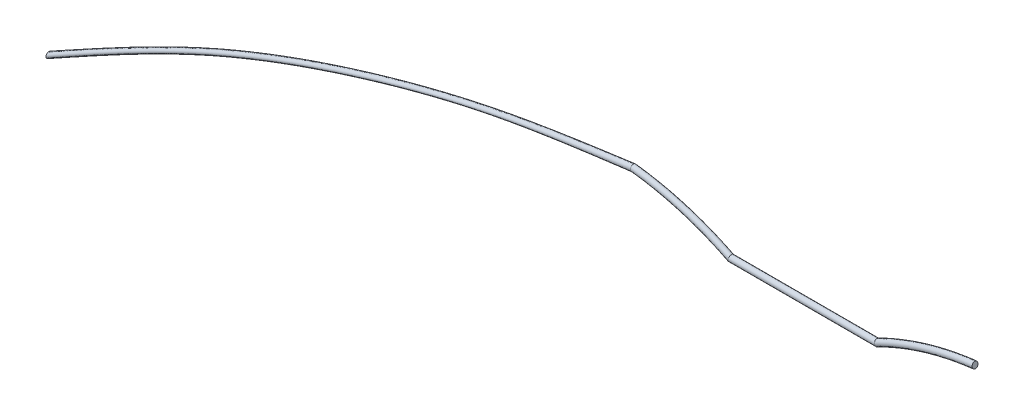
ISO-10303-21;
HEADER;
FILE_DESCRIPTION(('STEP AP214'),'2;1');
FILE_NAME('part.step','',(''),(''),'','','');
FILE_SCHEMA(('AUTOMOTIVE_DESIGN { 1 0 10303 214 1 1 1 1 }'));
ENDSEC;
DATA;
#1=APPLICATION_CONTEXT('core data for automotive mechanical design processes');
#2=APPLICATION_PROTOCOL_DEFINITION('international standard','automotive_design',2000,#1);
#3=PRODUCT_CONTEXT('',#1,'mechanical');
#4=PRODUCT('Part','Part','',(#3));
#5=PRODUCT_RELATED_PRODUCT_CATEGORY('part','',(#4));
#6=PRODUCT_DEFINITION_FORMATION('','',#4);
#7=PRODUCT_DEFINITION_CONTEXT('part definition',#1,'design');
#8=PRODUCT_DEFINITION('design','',#6,#7);
#9=PRODUCT_DEFINITION_SHAPE('','',#8);
#10=(LENGTH_UNIT() NAMED_UNIT(*) SI_UNIT(.MILLI.,.METRE.));
#11=(NAMED_UNIT(*) PLANE_ANGLE_UNIT() SI_UNIT($,.RADIAN.));
#12=(NAMED_UNIT(*) SI_UNIT($,.STERADIAN.) SOLID_ANGLE_UNIT());
#13=UNCERTAINTY_MEASURE_WITH_UNIT(LENGTH_MEASURE(1.E-05),#10,'distance_accuracy_value','');
#14=(GEOMETRIC_REPRESENTATION_CONTEXT(3) GLOBAL_UNCERTAINTY_ASSIGNED_CONTEXT((#13)) GLOBAL_UNIT_ASSIGNED_CONTEXT((#10,
#11,#12)) REPRESENTATION_CONTEXT('',''));
#15=CARTESIAN_POINT('',(0.,0.,0.));
#16=DIRECTION('',(0.,0.,1.));
#17=DIRECTION('',(1.,0.,0.));
#18=AXIS2_PLACEMENT_3D('',#15,#16,#17);
#19=CARTESIAN_POINT('',(-69.6424518241078,-26.4851945854484,-3.));
#20=CARTESIAN_POINT('',(-17.6556621893018,2.2418231542078,-2.99999999999825));
#21=CARTESIAN_POINT('',(85.9176675025857,59.4746875090797,-2.99999999999476));
#22=CARTESIAN_POINT('',(241.261624682536,115.88653819625,-3.00000000001895));
#23=CARTESIAN_POINT('',(389.29418202589,154.250267247059,-2.99999999994497));
#24=CARTESIAN_POINT('',(482.357328969648,166.585191522386,-3.00000000012178));
#25=CARTESIAN_POINT('',(529.270290602638,172.803204218905,-3.00000000021092));
#26=CARTESIAN_POINT('',(-69.6424518241078,-20.4851945854484,-3.));
#27=CARTESIAN_POINT('',(-17.3953350358502,8.2243355728806,-3.00000000001446));
#28=CARTESIAN_POINT('',(86.6966446877394,65.4223594030916,-3.00000000004327));
#29=CARTESIAN_POINT('',(242.439024030488,121.834458702321,-2.99999999984346));
#30=CARTESIAN_POINT('',(391.944921666677,159.620112669164,-3.00000000045462));
#31=CARTESIAN_POINT('',(483.265921419844,172.76618716726,-2.99999999899398));
#32=CARTESIAN_POINT('',(529.300669850343,179.393099202874,-2.99999999825767));
#33=CARTESIAN_POINT('',(-69.6424518241078,-20.4851945854484,3.));
#34=CARTESIAN_POINT('',(-17.3953350358502,8.2243355728806,2.99999999998554));
#35=CARTESIAN_POINT('',(86.6966446877394,65.4223594030916,2.99999999995673));
#36=CARTESIAN_POINT('',(242.439024030488,121.834458702321,3.00000000015654));
#37=CARTESIAN_POINT('',(391.944921666677,159.620112669164,2.99999999954538));
#38=CARTESIAN_POINT('',(483.265921419844,172.76618716726,3.00000000100602));
#39=CARTESIAN_POINT('',(529.300669850343,179.393099202874,3.00000000174233));
#40=CARTESIAN_POINT('',(-69.6424518241078,-26.4851945854484,3.));
#41=CARTESIAN_POINT('',(-17.6556621893018,2.2418231542078,3.00000000000175));
#42=CARTESIAN_POINT('',(85.9176675025857,59.4746875090797,3.00000000000524));
#43=CARTESIAN_POINT('',(241.261624682536,115.88653819625,2.99999999998105));
#44=CARTESIAN_POINT('',(389.29418202589,154.250267247059,3.00000000005504));
#45=CARTESIAN_POINT('',(482.357328969648,166.585191522386,2.99999999987822));
#46=CARTESIAN_POINT('',(529.270290602638,172.803204218905,2.99999999978908));
#47=CARTESIAN_POINT('',(-69.6424518241078,-32.4851945854484,3.));
#48=CARTESIAN_POINT('',(-17.9159893427533,-3.74068926446501,3.00000000001796));
#49=CARTESIAN_POINT('',(85.1386903174321,53.5270156150678,3.00000000005374));
#50=CARTESIAN_POINT('',(240.084225334583,109.93861769018,2.99999999980556));
#51=CARTESIAN_POINT('',(386.643442385103,148.880421824954,3.00000000056469));
#52=CARTESIAN_POINT('',(481.448736519453,160.404195877512,2.99999999875041));
#53=CARTESIAN_POINT('',(529.239911354932,166.213309234936,2.99999999783584));
#54=CARTESIAN_POINT('',(-69.6424518241078,-32.4851945854484,-3.));
#55=CARTESIAN_POINT('',(-17.9159893427533,-3.74068926446501,-2.99999999998204));
#56=CARTESIAN_POINT('',(85.1386903174321,53.5270156150678,-2.99999999994626));
#57=CARTESIAN_POINT('',(240.084225334583,109.93861769018,-3.00000000019444));
#58=CARTESIAN_POINT('',(386.643442385103,148.880421824954,-2.99999999943531));
#59=CARTESIAN_POINT('',(481.448736519453,160.404195877512,-3.00000000124959));
#60=CARTESIAN_POINT('',(529.239911354932,166.213309234936,-3.00000000216417));
#61=CARTESIAN_POINT('',(-69.6424518241078,-26.4851945854484,-3.));
#62=CARTESIAN_POINT('',(-17.6556621893018,2.2418231542078,-2.99999999999825));
#63=CARTESIAN_POINT('',(85.9176675025857,59.4746875090797,-2.99999999999476));
#64=CARTESIAN_POINT('',(241.261624682536,115.88653819625,-3.00000000001895));
#65=CARTESIAN_POINT('',(389.29418202589,154.250267247059,-2.99999999994497));
#66=CARTESIAN_POINT('',(482.357328969648,166.585191522386,-3.00000000012178));
#67=CARTESIAN_POINT('',(529.270290602638,172.803204218905,-3.00000000021092));
#68=(BOUNDED_SURFACE() B_SPLINE_SURFACE(3,3,((#19,#20,#21,#22,#23,#24,#25),(#26,#27,#28,#29,#30,
#31,#32),(#33,#34,#35,#36,#37,#38,#39),(#40,#41,#42,#43,#44,#45,#46),(#47,#48,#49,#50,#51,#52,
#53),(#54,#55,#56,#57,#58,#59,#60),(#61,#62,#63,#64,#65,#66,#67)),.UNSPECIFIED.,.T.,.F.,
.F.) B_SPLINE_SURFACE_WITH_KNOTS((4,3,4),(4,1,1,1,4),(0.,0.5,1.),(0.,0.279831205773446,
0.55750797341498,0.776940581231022,1.),
.UNSPECIFIED.) GEOMETRIC_REPRESENTATION_ITEM() RATIONAL_B_SPLINE_SURFACE(((1.,1.,1.,1.,1.,1.,
1.),(0.333333333333333,0.333333333333333,0.333333333333333,0.333333333333333,0.333333333333333,
0.333333333333333,0.333333333333333),(0.333333333333333,0.333333333333333,0.333333333333333,
0.333333333333333,0.333333333333333,0.333333333333333,0.333333333333333),(1.,1.,1.,1.,1.,1.,1.),
(0.333333333333333,0.333333333333333,0.333333333333333,0.333333333333333,0.333333333333333,
0.333333333333333,0.333333333333333),(0.333333333333333,0.333333333333333,0.333333333333333,
0.333333333333333,0.333333333333333,0.333333333333333,0.333333333333333),(1.,1.,1.,1.,1.,1.,1.))) REPRESENTATION_ITEM('') SURFACE());
#69=CARTESIAN_POINT('',(-69.6424518241078,-26.4851945854484,0.));
#70=DIRECTION('',(1.,0.,0.));
#71=DIRECTION('',(0.,0.,-1.));
#72=AXIS2_PLACEMENT_3D('',#69,#70,#71);
#73=CIRCLE('',#72,3.);
#74=CARTESIAN_POINT('',(-69.6424518241078,-26.4851945854484,-3.));
#75=VERTEX_POINT('',#74);
#76=EDGE_CURVE('E11',#75,#75,#73,.T.);
#77=CARTESIAN_POINT('',(529.270290602638,172.803204218905,-3.00000000021092));
#78=CARTESIAN_POINT('',(529.239911354932,166.213309234936,-3.00000000216418));
#79=CARTESIAN_POINT('',(529.239911354932,166.213309234936,2.99999999783583));
#80=CARTESIAN_POINT('',(529.270290602638,172.803204218905,2.99999999978908));
#81=CARTESIAN_POINT('',(529.300669850343,179.393099202874,3.00000000174234));
#82=CARTESIAN_POINT('',(529.300669850343,179.393099202874,-2.99999999825766));
#83=CARTESIAN_POINT('',(529.270290602638,172.803204218905,-3.00000000021092));
#84=(BOUNDED_CURVE() B_SPLINE_CURVE(3,(#77,#78,#79,#80,#81,#82,#83),.UNSPECIFIED.,.T.,
.F.) B_SPLINE_CURVE_WITH_KNOTS((4,3,4),(0.,0.5,1.),
.UNSPECIFIED.) CURVE() GEOMETRIC_REPRESENTATION_ITEM() RATIONAL_B_SPLINE_CURVE((1.,
0.333333333333333,0.333333333333333,1.,0.333333333333333,0.333333333333333,1.)) REPRESENTATION_ITEM(''));
#85=CARTESIAN_POINT('',(529.270290602638,172.803204218905,-3.00000000021092));
#86=VERTEX_POINT('',#85);
#87=EDGE_CURVE('E54',#86,#86,#84,.T.);
#88=ORIENTED_EDGE('',*,*,#76,.T.);
#89=EDGE_LOOP('',(#88));
#90=FACE_BOUND('',#89,.T.);
#91=ORIENTED_EDGE('',*,*,#87,.T.);
#92=EDGE_LOOP('',(#91));
#93=FACE_BOUND('',#92,.T.);
#94=ADVANCED_FACE('F42',(#90,#93),#68,.T.);
#95=CARTESIAN_POINT('',(-69.6424518241078,-26.4851945854484,0.));
#96=DIRECTION('',(1.,0.,0.));
#97=DIRECTION('',(0.,0.,-1.));
#98=AXIS2_PLACEMENT_3D('',#95,#96,#97);
#99=PLANE('',#98);
#100=ORIENTED_EDGE('',*,*,#76,.F.);
#101=EDGE_LOOP('',(#100));
#102=FACE_BOUND('',#101,.T.);
#103=ADVANCED_FACE('F104',(#102),#99,.F.);
#104=CARTESIAN_POINT('',(529.270290602638,172.803204218905,-3.00000000021092));
#105=CARTESIAN_POINT('',(538.929257472099,171.672214585256,-3.00000000021092));
#106=CARTESIAN_POINT('',(558.21202869416,168.441216393379,-3.00000000021092));
#107=CARTESIAN_POINT('',(591.95458858317,159.353230582968,-3.00000000021092));
#108=CARTESIAN_POINT('',(615.359093696992,149.727452801647,-3.00000000021093));
#109=CARTESIAN_POINT('',(629.105624751036,142.807651345816,-3.00000000021093));
#110=CARTESIAN_POINT('',(529.239911354932,166.213309234936,-3.00000000216418));
#111=CARTESIAN_POINT('',(538.898878224394,165.082319601287,-3.00000000216418));
#112=CARTESIAN_POINT('',(556.45271778155,162.046836069034,-3.00000000216417));
#113=CARTESIAN_POINT('',(589.702502315834,153.280533664548,-3.00000000216415));
#114=CARTESIAN_POINT('',(613.803800387678,143.178741137079,-3.00000000216424));
#115=CARTESIAN_POINT('',(627.550331441722,136.258939681247,-3.00000000216424));
#116=CARTESIAN_POINT('',(529.239911354932,166.213309234936,2.99999999783583));
#117=CARTESIAN_POINT('',(538.898878224394,165.082319601287,2.99999999783583));
#118=CARTESIAN_POINT('',(556.45271778155,162.046836069034,2.99999999783584));
#119=CARTESIAN_POINT('',(589.702502315834,153.280533664548,2.99999999783586));
#120=CARTESIAN_POINT('',(613.803800387678,143.178741137079,2.99999999783576));
#121=CARTESIAN_POINT('',(627.550331441722,136.258939681247,2.99999999783576));
#122=CARTESIAN_POINT('',(529.270290602638,172.803204218905,2.99999999978908));
#123=CARTESIAN_POINT('',(538.929257472099,171.672214585256,2.99999999978908));
#124=CARTESIAN_POINT('',(558.21202869416,168.441216393379,2.99999999978908));
#125=CARTESIAN_POINT('',(591.95458858317,159.353230582968,2.99999999978908));
#126=CARTESIAN_POINT('',(615.359093696992,149.727452801647,2.99999999978907));
#127=CARTESIAN_POINT('',(629.105624751036,142.807651345816,2.99999999978907));
#128=CARTESIAN_POINT('',(529.300669850343,179.393099202874,3.00000000174234));
#129=CARTESIAN_POINT('',(538.959636719805,178.262109569225,3.00000000174234));
#130=CARTESIAN_POINT('',(559.971339606771,174.835596717723,3.00000000174233));
#131=CARTESIAN_POINT('',(594.206674850506,165.425927501387,3.00000000174231));
#132=CARTESIAN_POINT('',(616.914387006306,156.276164466215,3.00000000174239));
#133=CARTESIAN_POINT('',(630.66091806035,149.356363010384,3.00000000174239));
#134=CARTESIAN_POINT('',(529.300669850343,179.393099202874,-2.99999999825766));
#135=CARTESIAN_POINT('',(538.959636719805,178.262109569225,-2.99999999825766));
#136=CARTESIAN_POINT('',(559.971339606771,174.835596717723,-2.99999999825767));
#137=CARTESIAN_POINT('',(594.206674850506,165.425927501387,-2.99999999825769));
#138=CARTESIAN_POINT('',(616.914387006306,156.276164466215,-2.99999999825761));
#139=CARTESIAN_POINT('',(630.66091806035,149.356363010384,-2.99999999825761));
#140=CARTESIAN_POINT('',(529.270290602638,172.803204218905,-3.00000000021092));
#141=CARTESIAN_POINT('',(538.929257472099,171.672214585256,-3.00000000021092));
#142=CARTESIAN_POINT('',(558.21202869416,168.441216393379,-3.00000000021092));
#143=CARTESIAN_POINT('',(591.95458858317,159.353230582968,-3.00000000021092));
#144=CARTESIAN_POINT('',(615.359093696992,149.727452801647,-3.00000000021093));
#145=CARTESIAN_POINT('',(629.105624751036,142.807651345816,-3.00000000021093));
#146=(BOUNDED_SURFACE() B_SPLINE_SURFACE(3,3,((#104,#105,#106,#107,#108,#109),(#110,#111,#112,
#113,#114,#115),(#116,#117,#118,#119,#120,#121),(#122,#123,#124,#125,#126,#127),(#128,#129,#130,
#131,#132,#133),(#134,#135,#136,#137,#138,#139),(#140,#141,#142,#143,#144,#145)),.UNSPECIFIED.,
.T.,.F.,.F.) B_SPLINE_SURFACE_WITH_KNOTS((4,3,4),(4,1,1,4),(0.,0.5,1.),(0.,0.278628463913905,
0.559063703868614,1.),
.UNSPECIFIED.) GEOMETRIC_REPRESENTATION_ITEM() RATIONAL_B_SPLINE_SURFACE(((1.,1.,1.,1.,1.,1.),
(0.333333333333333,0.333333333333333,0.333333333333333,0.333333333333333,0.333333333333333,
0.333333333333333),(0.333333333333333,0.333333333333333,0.333333333333333,0.333333333333333,
0.333333333333333,0.333333333333333),(1.,1.,1.,1.,1.,1.),(0.333333333333333,0.333333333333333,
0.333333333333333,0.333333333333333,0.333333333333333,0.333333333333333),(0.333333333333333,
0.333333333333333,0.333333333333333,0.333333333333333,0.333333333333333,0.333333333333333),(1.,
1.,1.,1.,1.,1.))) REPRESENTATION_ITEM('') SURFACE());
#147=CARTESIAN_POINT('',(629.105624751036,142.807651345816,-3.00000000021093));
#148=CARTESIAN_POINT('',(627.550331441722,136.258939681247,-3.00000000216424));
#149=CARTESIAN_POINT('',(627.550331441722,136.258939681247,2.99999999783576));
#150=CARTESIAN_POINT('',(629.105624751036,142.807651345816,2.99999999978907));
#151=CARTESIAN_POINT('',(630.66091806035,149.356363010384,3.00000000174239));
#152=CARTESIAN_POINT('',(630.66091806035,149.356363010384,-2.99999999825761));
#153=CARTESIAN_POINT('',(629.105624751036,142.807651345816,-3.00000000021093));
#154=(BOUNDED_CURVE() B_SPLINE_CURVE(3,(#147,#148,#149,#150,#151,#152,#153),.UNSPECIFIED.,.T.,
.F.) B_SPLINE_CURVE_WITH_KNOTS((4,3,4),(0.,0.5,1.),
.UNSPECIFIED.) CURVE() GEOMETRIC_REPRESENTATION_ITEM() RATIONAL_B_SPLINE_CURVE((1.,
0.333333333333333,0.333333333333333,1.,0.333333333333333,0.333333333333333,1.)) REPRESENTATION_ITEM(''));
#155=CARTESIAN_POINT('',(629.105624751036,142.807651345816,-3.00000000021093));
#156=VERTEX_POINT('',#155);
#157=EDGE_CURVE('E50',#156,#156,#154,.F.);
#158=ORIENTED_EDGE('',*,*,#87,.F.);
#159=EDGE_LOOP('',(#158));
#160=FACE_BOUND('',#159,.T.);
#161=ORIENTED_EDGE('',*,*,#157,.F.);
#162=EDGE_LOOP('',(#161));
#163=FACE_BOUND('',#162,.T.);
#164=ADVANCED_FACE('F101',(#160,#163),#146,.F.);
#165=CARTESIAN_POINT('',(629.105624751036,142.807651345816,-3.00000000021093));
#166=CARTESIAN_POINT('',(779.441517380944,142.807651345816,-3.00000000021093));
#167=CARTESIAN_POINT('',(630.66091806035,149.356363010384,-2.99999999825761));
#168=CARTESIAN_POINT('',(777.88622407163,149.356363010384,-2.9999999982576));
#169=CARTESIAN_POINT('',(630.66091806035,149.356363010384,3.00000000174239));
#170=CARTESIAN_POINT('',(777.88622407163,149.356363010384,3.00000000174239));
#171=CARTESIAN_POINT('',(629.105624751036,142.807651345816,2.99999999978907));
#172=CARTESIAN_POINT('',(779.441517380944,142.807651345816,2.99999999978907));
#173=CARTESIAN_POINT('',(627.550331441722,136.258939681247,2.99999999783576));
#174=CARTESIAN_POINT('',(780.996810690258,136.258939681248,2.99999999783575));
#175=CARTESIAN_POINT('',(627.550331441722,136.258939681247,-3.00000000216424));
#176=CARTESIAN_POINT('',(780.996810690258,136.258939681248,-3.00000000216425));
#177=CARTESIAN_POINT('',(629.105624751036,142.807651345816,-3.00000000021093));
#178=CARTESIAN_POINT('',(779.441517380944,142.807651345816,-3.00000000021093));
#179=(BOUNDED_SURFACE() B_SPLINE_SURFACE(3,1,((#165,#166),(#167,#168),(#169,#170),(#171,#172),
(#173,#174),(#175,#176),(#177,#178)),.UNSPECIFIED.,.T.,.F.,.F.) B_SPLINE_SURFACE_WITH_KNOTS((4,
3,4),(2,2),(0.,0.5,1.),(0.,1.),
.UNSPECIFIED.) GEOMETRIC_REPRESENTATION_ITEM() RATIONAL_B_SPLINE_SURFACE(((1.,1.),
(0.333333333333333,0.333333333333333),(0.333333333333333,0.333333333333333),(1.,1.),
(0.333333333333333,0.333333333333333),(0.333333333333333,0.333333333333333),(1.,1.))) REPRESENTATION_ITEM('') SURFACE());
#180=CARTESIAN_POINT('',(779.441517380944,142.807651345816,-3.00000000021093));
#181=CARTESIAN_POINT('',(780.996810690258,136.258939681248,-3.00000000216423));
#182=CARTESIAN_POINT('',(780.996810690258,136.258939681248,2.99999999783577));
#183=CARTESIAN_POINT('',(779.441517380944,142.807651345816,2.99999999978907));
#184=CARTESIAN_POINT('',(777.88622407163,149.356363010384,3.00000000174238));
#185=CARTESIAN_POINT('',(777.88622407163,149.356363010384,-2.99999999825762));
#186=CARTESIAN_POINT('',(779.441517380944,142.807651345816,-3.00000000021093));
#187=(BOUNDED_CURVE() B_SPLINE_CURVE(3,(#180,#181,#182,#183,#184,#185,#186),.UNSPECIFIED.,.T.,
.F.) B_SPLINE_CURVE_WITH_KNOTS((4,3,4),(0.,0.5,1.),
.UNSPECIFIED.) CURVE() GEOMETRIC_REPRESENTATION_ITEM() RATIONAL_B_SPLINE_CURVE((1.,
0.333333333333333,0.333333333333333,1.,0.333333333333333,0.333333333333333,1.)) REPRESENTATION_ITEM(''));
#188=CARTESIAN_POINT('',(779.441517380944,142.807651345816,-3.00000000021093));
#189=VERTEX_POINT('',#188);
#190=EDGE_CURVE('E75',#189,#189,#187,.T.);
#191=ORIENTED_EDGE('',*,*,#157,.T.);
#192=EDGE_LOOP('',(#191));
#193=FACE_BOUND('',#192,.T.);
#194=ORIENTED_EDGE('',*,*,#190,.T.);
#195=EDGE_LOOP('',(#194));
#196=FACE_BOUND('',#195,.T.);
#197=ADVANCED_FACE('F87',(#193,#196),#179,.T.);
#198=CARTESIAN_POINT('',(879.355811425911,172.812449806523,2.99999999978907));
#199=DIRECTION('',(0.99321440557424,0.11629765500563,0.));
#200=DIRECTION('',(-0.11629765500563,0.99321440557424,0.));
#201=AXIS2_PLACEMENT_3D('',#198,#199,#200);
#202=PLANE('',#201);
#203=CARTESIAN_POINT('',(879.355811425911,172.812449806523,-3.00000000021093));
#204=CARTESIAN_POINT('',(880.117411235809,166.308175043321,-3.00000000216425));
#205=CARTESIAN_POINT('',(880.117411235809,166.308175043321,2.99999999783575));
#206=CARTESIAN_POINT('',(879.355811425911,172.812449806523,2.99999999978907));
#207=CARTESIAN_POINT('',(878.594211616014,179.316724569724,3.00000000174239));
#208=CARTESIAN_POINT('',(878.594211616014,179.316724569724,-2.9999999982576));
#209=CARTESIAN_POINT('',(879.355811425911,172.812449806523,-3.00000000021093));
#210=(BOUNDED_CURVE() B_SPLINE_CURVE(3,(#203,#204,#205,#206,#207,#208,#209),.UNSPECIFIED.,.T.,
.F.) B_SPLINE_CURVE_WITH_KNOTS((4,3,4),(0.,0.5,1.),
.UNSPECIFIED.) CURVE() GEOMETRIC_REPRESENTATION_ITEM() RATIONAL_B_SPLINE_CURVE((1.,
0.333333333333333,0.333333333333333,1.,0.333333333333333,0.333333333333333,1.)) REPRESENTATION_ITEM(''));
#211=CARTESIAN_POINT('',(879.355811425911,172.812449806523,-3.00000000021093));
#212=VERTEX_POINT('',#211);
#213=EDGE_CURVE('E58',#212,#212,#210,.F.);
#214=ORIENTED_EDGE('',*,*,#213,.T.);
#215=EDGE_LOOP('',(#214));
#216=FACE_BOUND('',#215,.T.);
#217=ADVANCED_FACE('F92',(#216),#202,.T.);
#218=CARTESIAN_POINT('',(779.441517380944,142.807651345816,-3.00000000021093));
#219=CARTESIAN_POINT('',(788.201574578298,147.217335236908,-3.00000000021092));
#220=CARTESIAN_POINT('',(806.145992362723,155.186470265757,-3.00000000021093));
#221=CARTESIAN_POINT('',(839.346972834404,166.173542543371,-3.00000000021093));
#222=CARTESIAN_POINT('',(864.125723050853,171.029125326323,-3.00000000021093));
#223=CARTESIAN_POINT('',(879.355811425911,172.812449806523,-3.00000000021093));
#224=CARTESIAN_POINT('',(780.996810690258,136.258939681248,-3.00000000216423));
#225=CARTESIAN_POINT('',(789.756867887612,140.668623572339,-3.00000000216423));
#226=CARTESIAN_POINT('',(809.037439066018,149.342108383295,-3.00000000216426));
#227=CARTESIAN_POINT('',(840.826200103402,159.697756207684,-3.00000000216425));
#228=CARTESIAN_POINT('',(864.88732286075,164.524850563122,-3.00000000216425));
#229=CARTESIAN_POINT('',(880.117411235809,166.308175043321,-3.00000000216425));
#230=CARTESIAN_POINT('',(780.996810690258,136.258939681248,2.99999999783577));
#231=CARTESIAN_POINT('',(789.756867887612,140.668623572339,2.99999999783577));
#232=CARTESIAN_POINT('',(809.037439066018,149.342108383295,2.99999999783574));
#233=CARTESIAN_POINT('',(840.826200103402,159.697756207684,2.99999999783576));
#234=CARTESIAN_POINT('',(864.88732286075,164.524850563122,2.99999999783575));
#235=CARTESIAN_POINT('',(880.117411235809,166.308175043321,2.99999999783575));
#236=CARTESIAN_POINT('',(779.441517380944,142.807651345816,2.99999999978907));
#237=CARTESIAN_POINT('',(788.201574578298,147.217335236908,2.99999999978907));
#238=CARTESIAN_POINT('',(806.145992362723,155.186470265757,2.99999999978907));
#239=CARTESIAN_POINT('',(839.346972834404,166.173542543371,2.99999999978907));
#240=CARTESIAN_POINT('',(864.125723050853,171.029125326323,2.99999999978907));
#241=CARTESIAN_POINT('',(879.355811425911,172.812449806523,2.99999999978907));
#242=CARTESIAN_POINT('',(777.88622407163,149.356363010384,3.00000000174238));
#243=CARTESIAN_POINT('',(786.646281268984,153.766046901476,3.00000000174238));
#244=CARTESIAN_POINT('',(803.25454565943,161.030832148218,3.0000000017424));
#245=CARTESIAN_POINT('',(837.867745565408,172.649328879058,3.00000000174239));
#246=CARTESIAN_POINT('',(863.364123240955,177.533400089524,3.00000000174239));
#247=CARTESIAN_POINT('',(878.594211616014,179.316724569724,3.00000000174239));
#248=CARTESIAN_POINT('',(777.88622407163,149.356363010384,-2.99999999825762));
#249=CARTESIAN_POINT('',(786.646281268984,153.766046901476,-2.99999999825762));
#250=CARTESIAN_POINT('',(803.25454565943,161.030832148218,-2.9999999982576));
#251=CARTESIAN_POINT('',(837.867745565408,172.649328879058,-2.99999999825761));
#252=CARTESIAN_POINT('',(863.364123240955,177.533400089524,-2.9999999982576));
#253=CARTESIAN_POINT('',(878.594211616014,179.316724569724,-2.9999999982576));
#254=CARTESIAN_POINT('',(779.441517380944,142.807651345816,-3.00000000021093));
#255=CARTESIAN_POINT('',(788.201574578298,147.217335236908,-3.00000000021092));
#256=CARTESIAN_POINT('',(806.145992362723,155.186470265757,-3.00000000021093));
#257=CARTESIAN_POINT('',(839.346972834404,166.173542543371,-3.00000000021093));
#258=CARTESIAN_POINT('',(864.125723050853,171.029125326323,-3.00000000021093));
#259=CARTESIAN_POINT('',(879.355811425911,172.812449806523,-3.00000000021093));
#260=(BOUNDED_SURFACE() B_SPLINE_SURFACE(3,3,((#218,#219,#220,#221,#222,#223),(#224,#225,#226,
#227,#228,#229),(#230,#231,#232,#233,#234,#235),(#236,#237,#238,#239,#240,#241),(#242,#243,#244,
#245,#246,#247),(#248,#249,#250,#251,#252,#253),(#254,#255,#256,#257,#258,#259)),.UNSPECIFIED.,
.T.,.F.,.F.) B_SPLINE_SURFACE_WITH_KNOTS((4,3,4),(4,1,1,4),(0.,0.5,1.),(0.,0.280775637205964,
0.560997708413798,1.),
.UNSPECIFIED.) GEOMETRIC_REPRESENTATION_ITEM() RATIONAL_B_SPLINE_SURFACE(((1.,1.,1.,1.,1.,1.),
(0.333333333333333,0.333333333333333,0.333333333333333,0.333333333333333,0.333333333333333,
0.333333333333333),(0.333333333333333,0.333333333333333,0.333333333333333,0.333333333333333,
0.333333333333333,0.333333333333333),(1.,1.,1.,1.,1.,1.),(0.333333333333333,0.333333333333333,
0.333333333333333,0.333333333333333,0.333333333333333,0.333333333333333),(0.333333333333333,
0.333333333333333,0.333333333333333,0.333333333333333,0.333333333333333,0.333333333333333),(1.,
1.,1.,1.,1.,1.))) REPRESENTATION_ITEM('') SURFACE());
#261=ORIENTED_EDGE('',*,*,#190,.F.);
#262=EDGE_LOOP('',(#261));
#263=FACE_BOUND('',#262,.T.);
#264=ORIENTED_EDGE('',*,*,#213,.F.);
#265=EDGE_LOOP('',(#264));
#266=FACE_BOUND('',#265,.T.);
#267=ADVANCED_FACE('F89',(#263,#266),#260,.F.);
#268=CLOSED_SHELL('',(#94,#103,#164,#197,#217,#267));
#269=MANIFOLD_SOLID_BREP('B2',#268);
#270=ADVANCED_BREP_SHAPE_REPRESENTATION('',(#18,#269),#14);
#271=SHAPE_DEFINITION_REPRESENTATION(#9,#270);
ENDSEC;
END-ISO-10303-21;
